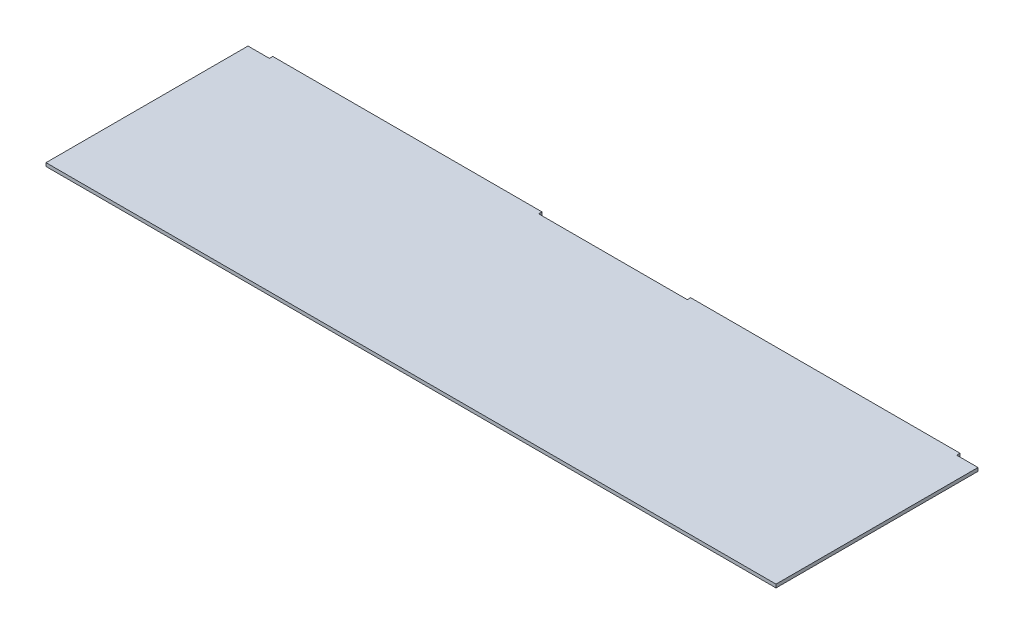
ISO-10303-21;
HEADER;
FILE_DESCRIPTION(('STEP AP214'),'2;1');
FILE_NAME('part.step','',(''),(''),'','','');
FILE_SCHEMA(('AUTOMOTIVE_DESIGN { 1 0 10303 214 1 1 1 1 }'));
ENDSEC;
DATA;
#1=APPLICATION_CONTEXT('core data for automotive mechanical design processes');
#2=APPLICATION_PROTOCOL_DEFINITION('international standard','automotive_design',2000,#1);
#3=PRODUCT_CONTEXT('',#1,'mechanical');
#4=PRODUCT('Part','Part','',(#3));
#5=PRODUCT_RELATED_PRODUCT_CATEGORY('part','',(#4));
#6=PRODUCT_DEFINITION_FORMATION('','',#4);
#7=PRODUCT_DEFINITION_CONTEXT('part definition',#1,'design');
#8=PRODUCT_DEFINITION('design','',#6,#7);
#9=PRODUCT_DEFINITION_SHAPE('','',#8);
#10=(LENGTH_UNIT() NAMED_UNIT(*) SI_UNIT(.MILLI.,.METRE.));
#11=(NAMED_UNIT(*) PLANE_ANGLE_UNIT() SI_UNIT($,.RADIAN.));
#12=(NAMED_UNIT(*) SI_UNIT($,.STERADIAN.) SOLID_ANGLE_UNIT());
#13=UNCERTAINTY_MEASURE_WITH_UNIT(LENGTH_MEASURE(1.E-05),#10,'distance_accuracy_value','');
#14=(GEOMETRIC_REPRESENTATION_CONTEXT(3) GLOBAL_UNCERTAINTY_ASSIGNED_CONTEXT((#13)) GLOBAL_UNIT_ASSIGNED_CONTEXT((#10,
#11,#12)) REPRESENTATION_CONTEXT('',''));
#15=CARTESIAN_POINT('',(0.,0.,0.));
#16=DIRECTION('',(0.,0.,1.));
#17=DIRECTION('',(1.,0.,0.));
#18=AXIS2_PLACEMENT_3D('',#15,#16,#17);
#19=CARTESIAN_POINT('',(-344.2208,1.5875,-95.25));
#20=DIRECTION('',(0.,0.,1.));
#21=DIRECTION('',(1.,0.,0.));
#22=AXIS2_PLACEMENT_3D('',#19,#20,#21);
#23=PLANE('',#22);
#24=DIRECTION('',(0.,1.,0.));
#25=VECTOR('',#24,1.);
#26=CARTESIAN_POINT('',(-324.0659,-1.5875,-95.25));
#27=LINE('',#26,#25);
#28=CARTESIAN_POINT('',(-324.0659,-1.5875,-95.25));
#29=VERTEX_POINT('',#28);
#30=CARTESIAN_POINT('',(-324.0659,1.5875,-95.25));
#31=VERTEX_POINT('',#30);
#32=EDGE_CURVE('E231',#29,#31,#27,.T.);
#33=ORIENTED_EDGE('',*,*,#32,.F.);
#34=DIRECTION('',(-1.,0.,0.));
#35=VECTOR('',#34,1.);
#36=CARTESIAN_POINT('',(-344.2208,-1.5875,-95.25));
#37=LINE('',#36,#35);
#38=CARTESIAN_POINT('',(-344.2208,-1.5875,-95.25));
#39=VERTEX_POINT('',#38);
#40=EDGE_CURVE('E146',#29,#39,#37,.T.);
#41=ORIENTED_EDGE('',*,*,#40,.T.);
#42=DIRECTION('',(0.,-1.,0.));
#43=VECTOR('',#42,1.);
#44=CARTESIAN_POINT('',(-344.2208,1.5875,-95.25));
#45=LINE('',#44,#43);
#46=CARTESIAN_POINT('',(-344.2208,1.5875,-95.25));
#47=VERTEX_POINT('',#46);
#48=EDGE_CURVE('E41',#47,#39,#45,.T.);
#49=ORIENTED_EDGE('',*,*,#48,.F.);
#50=DIRECTION('',(-1.,0.,0.));
#51=VECTOR('',#50,1.);
#52=CARTESIAN_POINT('',(-344.2208,1.5875,-95.25));
#53=LINE('',#52,#51);
#54=EDGE_CURVE('E48',#31,#47,#53,.T.);
#55=ORIENTED_EDGE('',*,*,#54,.F.);
#56=EDGE_LOOP('',(#33,#41,#49,#55));
#57=FACE_BOUND('',#56,.T.);
#58=ADVANCED_FACE('F33',(#57),#23,.F.);
#59=DIRECTION('',(0.,-1.,0.));
#60=VECTOR('',#59,1.);
#61=CARTESIAN_POINT('',(-70.0658999999999,-1.5875,-95.25));
#62=LINE('',#61,#60);
#63=CARTESIAN_POINT('',(-70.0658999999998,1.5875,-95.25));
#64=VERTEX_POINT('',#63);
#65=CARTESIAN_POINT('',(-70.0658999999998,-1.5875,-95.25));
#66=VERTEX_POINT('',#65);
#67=EDGE_CURVE('E56',#64,#66,#62,.T.);
#68=ORIENTED_EDGE('',*,*,#67,.F.);
#69=CARTESIAN_POINT('',(70.0658999999999,1.5875,-95.25));
#70=VERTEX_POINT('',#69);
#71=EDGE_CURVE('E188',#70,#64,#53,.T.);
#72=ORIENTED_EDGE('',*,*,#71,.F.);
#73=DIRECTION('',(0.,1.,0.));
#74=VECTOR('',#73,1.);
#75=CARTESIAN_POINT('',(70.0658999999999,-1.5875,-95.25));
#76=LINE('',#75,#74);
#77=CARTESIAN_POINT('',(70.0658999999998,-1.5875,-95.25));
#78=VERTEX_POINT('',#77);
#79=EDGE_CURVE('E150',#78,#70,#76,.T.);
#80=ORIENTED_EDGE('',*,*,#79,.F.);
#81=EDGE_CURVE('E198',#78,#66,#37,.T.);
#82=ORIENTED_EDGE('',*,*,#81,.T.);
#83=EDGE_LOOP('',(#68,#72,#80,#82));
#84=FACE_BOUND('',#83,.T.);
#85=ADVANCED_FACE('F235',(#84),#23,.F.);
#86=DIRECTION('',(0.,-1.,0.));
#87=VECTOR('',#86,1.);
#88=CARTESIAN_POINT('',(324.0659,-1.5875,-95.25));
#89=LINE('',#88,#87);
#90=CARTESIAN_POINT('',(324.0659,1.5875,-95.25));
#91=VERTEX_POINT('',#90);
#92=CARTESIAN_POINT('',(324.0659,-1.5875,-95.25));
#93=VERTEX_POINT('',#92);
#94=EDGE_CURVE('E147',#91,#93,#89,.T.);
#95=ORIENTED_EDGE('',*,*,#94,.F.);
#96=CARTESIAN_POINT('',(344.2208,1.5875,-95.25));
#97=VERTEX_POINT('',#96);
#98=EDGE_CURVE('E184',#97,#91,#53,.T.);
#99=ORIENTED_EDGE('',*,*,#98,.F.);
#100=DIRECTION('',(0.,-1.,0.));
#101=VECTOR('',#100,1.);
#102=CARTESIAN_POINT('',(344.2208,1.5875,-95.25));
#103=LINE('',#102,#101);
#104=CARTESIAN_POINT('',(344.2208,-1.5875,-95.25));
#105=VERTEX_POINT('',#104);
#106=EDGE_CURVE('E11',#97,#105,#103,.T.);
#107=ORIENTED_EDGE('',*,*,#106,.T.);
#108=EDGE_CURVE('E195',#105,#93,#37,.T.);
#109=ORIENTED_EDGE('',*,*,#108,.T.);
#110=EDGE_LOOP('',(#95,#99,#107,#109));
#111=FACE_BOUND('',#110,.T.);
#112=ADVANCED_FACE('F247',(#111),#23,.F.);
#113=CARTESIAN_POINT('',(344.2208,1.5875,-95.25));
#114=DIRECTION('',(-1.,0.,0.));
#115=DIRECTION('',(0.,0.,1.));
#116=AXIS2_PLACEMENT_3D('',#113,#114,#115);
#117=PLANE('',#116);
#118=DIRECTION('',(0.,0.,-1.));
#119=VECTOR('',#118,1.);
#120=CARTESIAN_POINT('',(344.2208,-1.5875,-95.25));
#121=LINE('',#120,#119);
#122=CARTESIAN_POINT('',(344.2208,-1.5875,95.25));
#123=VERTEX_POINT('',#122);
#124=EDGE_CURVE('E179',#123,#105,#121,.T.);
#125=ORIENTED_EDGE('',*,*,#124,.T.);
#126=ORIENTED_EDGE('',*,*,#106,.F.);
#127=DIRECTION('',(0.,0.,-1.));
#128=VECTOR('',#127,1.);
#129=CARTESIAN_POINT('',(344.2208,1.5875,-95.25));
#130=LINE('',#129,#128);
#131=CARTESIAN_POINT('',(344.2208,1.5875,95.25));
#132=VERTEX_POINT('',#131);
#133=EDGE_CURVE('E180',#132,#97,#130,.T.);
#134=ORIENTED_EDGE('',*,*,#133,.F.);
#135=DIRECTION('',(0.,-1.,0.));
#136=VECTOR('',#135,1.);
#137=CARTESIAN_POINT('',(344.2208,1.5875,95.25));
#138=LINE('',#137,#136);
#139=EDGE_CURVE('E192',#132,#123,#138,.T.);
#140=ORIENTED_EDGE('',*,*,#139,.T.);
#141=EDGE_LOOP('',(#125,#126,#134,#140));
#142=FACE_BOUND('',#141,.T.);
#143=ADVANCED_FACE('F35',(#142),#117,.F.);
#144=CARTESIAN_POINT('',(-344.2208,1.5875,-95.25));
#145=DIRECTION('',(1.,0.,0.));
#146=DIRECTION('',(0.,0.,-1.));
#147=AXIS2_PLACEMENT_3D('',#144,#145,#146);
#148=PLANE('',#147);
#149=DIRECTION('',(0.,0.,1.));
#150=VECTOR('',#149,1.);
#151=CARTESIAN_POINT('',(-344.2208,-1.5875,-95.25));
#152=LINE('',#151,#150);
#153=CARTESIAN_POINT('',(-344.2208,-1.5875,95.25));
#154=VERTEX_POINT('',#153);
#155=EDGE_CURVE('E197',#39,#154,#152,.T.);
#156=ORIENTED_EDGE('',*,*,#155,.T.);
#157=DIRECTION('',(0.,-1.,0.));
#158=VECTOR('',#157,1.);
#159=CARTESIAN_POINT('',(-344.2208,1.5875,95.25));
#160=LINE('',#159,#158);
#161=CARTESIAN_POINT('',(-344.2208,1.5875,95.25));
#162=VERTEX_POINT('',#161);
#163=EDGE_CURVE('E203',#162,#154,#160,.T.);
#164=ORIENTED_EDGE('',*,*,#163,.F.);
#165=DIRECTION('',(0.,0.,1.));
#166=VECTOR('',#165,1.);
#167=CARTESIAN_POINT('',(-344.2208,1.5875,-95.25));
#168=LINE('',#167,#166);
#169=EDGE_CURVE('E187',#47,#162,#168,.T.);
#170=ORIENTED_EDGE('',*,*,#169,.F.);
#171=ORIENTED_EDGE('',*,*,#48,.T.);
#172=EDGE_LOOP('',(#156,#164,#170,#171));
#173=FACE_BOUND('',#172,.T.);
#174=ADVANCED_FACE('F208',(#173),#148,.F.);
#175=CARTESIAN_POINT('',(-344.2208,1.5875,95.25));
#176=DIRECTION('',(0.,0.,-1.));
#177=DIRECTION('',(-1.,0.,0.));
#178=AXIS2_PLACEMENT_3D('',#175,#176,#177);
#179=PLANE('',#178);
#180=DIRECTION('',(1.,0.,0.));
#181=VECTOR('',#180,1.);
#182=CARTESIAN_POINT('',(-344.2208,-1.5875,95.25));
#183=LINE('',#182,#181);
#184=EDGE_CURVE('E183',#154,#123,#183,.T.);
#185=ORIENTED_EDGE('',*,*,#184,.T.);
#186=ORIENTED_EDGE('',*,*,#139,.F.);
#187=DIRECTION('',(1.,0.,0.));
#188=VECTOR('',#187,1.);
#189=CARTESIAN_POINT('',(-344.2208,1.5875,95.25));
#190=LINE('',#189,#188);
#191=EDGE_CURVE('E190',#162,#132,#190,.T.);
#192=ORIENTED_EDGE('',*,*,#191,.F.);
#193=ORIENTED_EDGE('',*,*,#163,.T.);
#194=EDGE_LOOP('',(#185,#186,#192,#193));
#195=FACE_BOUND('',#194,.T.);
#196=ADVANCED_FACE('F213',(#195),#179,.F.);
#197=CARTESIAN_POINT('',(0.,1.5875,0.));
#198=DIRECTION('',(0.,1.,0.));
#199=DIRECTION('',(0.,0.,1.));
#200=AXIS2_PLACEMENT_3D('',#197,#198,#199);
#201=PLANE('',#200);
#202=ORIENTED_EDGE('',*,*,#133,.T.);
#203=ORIENTED_EDGE('',*,*,#98,.T.);
#204=DIRECTION('',(0.,0.,1.));
#205=VECTOR('',#204,1.);
#206=CARTESIAN_POINT('',(324.0659,1.5875,-98.425));
#207=LINE('',#206,#205);
#208=CARTESIAN_POINT('',(324.0659,1.5875,-98.425));
#209=VERTEX_POINT('',#208);
#210=EDGE_CURVE('E164',#209,#91,#207,.T.);
#211=ORIENTED_EDGE('',*,*,#210,.F.);
#212=DIRECTION('',(1.,0.,0.));
#213=VECTOR('',#212,1.);
#214=CARTESIAN_POINT('',(324.0659,1.5875,-98.425));
#215=LINE('',#214,#213);
#216=CARTESIAN_POINT('',(70.0658999999999,1.5875,-98.425));
#217=VERTEX_POINT('',#216);
#218=EDGE_CURVE('E163',#217,#209,#215,.T.);
#219=ORIENTED_EDGE('',*,*,#218,.F.);
#220=DIRECTION('',(0.,0.,1.));
#221=VECTOR('',#220,1.);
#222=CARTESIAN_POINT('',(70.0658999999999,1.5875,-98.425));
#223=LINE('',#222,#221);
#224=EDGE_CURVE('E170',#217,#70,#223,.T.);
#225=ORIENTED_EDGE('',*,*,#224,.T.);
#226=ORIENTED_EDGE('',*,*,#71,.T.);
#227=DIRECTION('',(0.,0.,1.));
#228=VECTOR('',#227,1.);
#229=CARTESIAN_POINT('',(-70.0658999999999,1.5875,-98.425));
#230=LINE('',#229,#228);
#231=CARTESIAN_POINT('',(-70.0658999999999,1.5875,-98.425));
#232=VERTEX_POINT('',#231);
#233=EDGE_CURVE('E152',#232,#64,#230,.T.);
#234=ORIENTED_EDGE('',*,*,#233,.F.);
#235=DIRECTION('',(1.,0.,0.));
#236=VECTOR('',#235,1.);
#237=CARTESIAN_POINT('',(-324.0659,1.5875,-98.425));
#238=LINE('',#237,#236);
#239=CARTESIAN_POINT('',(-324.0659,1.5875,-98.425));
#240=VERTEX_POINT('',#239);
#241=EDGE_CURVE('E132',#240,#232,#238,.T.);
#242=ORIENTED_EDGE('',*,*,#241,.F.);
#243=DIRECTION('',(0.,0.,1.));
#244=VECTOR('',#243,1.);
#245=CARTESIAN_POINT('',(-324.0659,1.5875,-98.425));
#246=LINE('',#245,#244);
#247=EDGE_CURVE('E129',#240,#31,#246,.T.);
#248=ORIENTED_EDGE('',*,*,#247,.T.);
#249=ORIENTED_EDGE('',*,*,#54,.T.);
#250=ORIENTED_EDGE('',*,*,#169,.T.);
#251=ORIENTED_EDGE('',*,*,#191,.T.);
#252=EDGE_LOOP('',(#202,#203,#211,#219,#225,#226,#234,#242,#248,#249,#250,#251));
#253=FACE_BOUND('',#252,.T.);
#254=ADVANCED_FACE('F219',(#253),#201,.T.);
#255=CARTESIAN_POINT('',(0.,-1.5875,0.));
#256=DIRECTION('',(0.,1.,0.));
#257=DIRECTION('',(0.,0.,1.));
#258=AXIS2_PLACEMENT_3D('',#255,#256,#257);
#259=PLANE('',#258);
#260=ORIENTED_EDGE('',*,*,#124,.F.);
#261=ORIENTED_EDGE('',*,*,#184,.F.);
#262=ORIENTED_EDGE('',*,*,#155,.F.);
#263=ORIENTED_EDGE('',*,*,#40,.F.);
#264=DIRECTION('',(0.,0.,1.));
#265=VECTOR('',#264,1.);
#266=CARTESIAN_POINT('',(-324.0659,-1.5875,-98.425));
#267=LINE('',#266,#265);
#268=CARTESIAN_POINT('',(-324.0659,-1.5875,-98.425));
#269=VERTEX_POINT('',#268);
#270=EDGE_CURVE('E127',#269,#29,#267,.T.);
#271=ORIENTED_EDGE('',*,*,#270,.F.);
#272=DIRECTION('',(-1.,0.,0.));
#273=VECTOR('',#272,1.);
#274=CARTESIAN_POINT('',(-324.0659,-1.5875,-98.425));
#275=LINE('',#274,#273);
#276=CARTESIAN_POINT('',(-70.0658999999999,-1.5875,-98.425));
#277=VERTEX_POINT('',#276);
#278=EDGE_CURVE('E133',#277,#269,#275,.T.);
#279=ORIENTED_EDGE('',*,*,#278,.F.);
#280=DIRECTION('',(0.,0.,1.));
#281=VECTOR('',#280,1.);
#282=CARTESIAN_POINT('',(-70.0658999999999,-1.5875,-98.425));
#283=LINE('',#282,#281);
#284=EDGE_CURVE('E227',#277,#66,#283,.T.);
#285=ORIENTED_EDGE('',*,*,#284,.T.);
#286=ORIENTED_EDGE('',*,*,#81,.F.);
#287=DIRECTION('',(0.,0.,1.));
#288=VECTOR('',#287,1.);
#289=CARTESIAN_POINT('',(70.0658999999999,-1.5875,-98.425));
#290=LINE('',#289,#288);
#291=CARTESIAN_POINT('',(70.0658999999999,-1.5875,-98.425));
#292=VERTEX_POINT('',#291);
#293=EDGE_CURVE('E173',#292,#78,#290,.T.);
#294=ORIENTED_EDGE('',*,*,#293,.F.);
#295=DIRECTION('',(-1.,0.,0.));
#296=VECTOR('',#295,1.);
#297=CARTESIAN_POINT('',(324.0659,-1.5875,-98.425));
#298=LINE('',#297,#296);
#299=CARTESIAN_POINT('',(324.0659,-1.5875,-98.425));
#300=VERTEX_POINT('',#299);
#301=EDGE_CURVE('E159',#300,#292,#298,.T.);
#302=ORIENTED_EDGE('',*,*,#301,.F.);
#303=DIRECTION('',(0.,0.,1.));
#304=VECTOR('',#303,1.);
#305=CARTESIAN_POINT('',(324.0659,-1.5875,-98.425));
#306=LINE('',#305,#304);
#307=EDGE_CURVE('E176',#300,#93,#306,.T.);
#308=ORIENTED_EDGE('',*,*,#307,.T.);
#309=ORIENTED_EDGE('',*,*,#108,.F.);
#310=EDGE_LOOP('',(#260,#261,#262,#263,#271,#279,#285,#286,#294,#302,#308,#309));
#311=FACE_BOUND('',#310,.T.);
#312=ADVANCED_FACE('F144',(#311),#259,.F.);
#313=CARTESIAN_POINT('',(324.0659,-1.5875,-98.425));
#314=DIRECTION('',(-1.,0.,0.));
#315=DIRECTION('',(0.,0.,1.));
#316=AXIS2_PLACEMENT_3D('',#313,#314,#315);
#317=PLANE('',#316);
#318=ORIENTED_EDGE('',*,*,#94,.T.);
#319=ORIENTED_EDGE('',*,*,#307,.F.);
#320=DIRECTION('',(0.,-1.,0.));
#321=VECTOR('',#320,1.);
#322=CARTESIAN_POINT('',(324.0659,-1.5875,-98.425));
#323=LINE('',#322,#321);
#324=EDGE_CURVE('E156',#209,#300,#323,.T.);
#325=ORIENTED_EDGE('',*,*,#324,.F.);
#326=ORIENTED_EDGE('',*,*,#210,.T.);
#327=EDGE_LOOP('',(#318,#319,#325,#326));
#328=FACE_BOUND('',#327,.T.);
#329=ADVANCED_FACE('F245',(#328),#317,.F.);
#330=CARTESIAN_POINT('',(70.0658999999999,-1.5875,-98.425));
#331=DIRECTION('',(1.,0.,0.));
#332=DIRECTION('',(0.,0.,-1.));
#333=AXIS2_PLACEMENT_3D('',#330,#331,#332);
#334=PLANE('',#333);
#335=ORIENTED_EDGE('',*,*,#79,.T.);
#336=ORIENTED_EDGE('',*,*,#224,.F.);
#337=DIRECTION('',(0.,1.,0.));
#338=VECTOR('',#337,1.);
#339=CARTESIAN_POINT('',(70.0658999999999,-1.5875,-98.425));
#340=LINE('',#339,#338);
#341=EDGE_CURVE('E161',#292,#217,#340,.T.);
#342=ORIENTED_EDGE('',*,*,#341,.F.);
#343=ORIENTED_EDGE('',*,*,#293,.T.);
#344=EDGE_LOOP('',(#335,#336,#342,#343));
#345=FACE_BOUND('',#344,.T.);
#346=ADVANCED_FACE('F239',(#345),#334,.F.);
#347=CARTESIAN_POINT('',(0.,0.,-98.425));
#348=DIRECTION('',(0.,0.,1.));
#349=DIRECTION('',(1.,0.,0.));
#350=AXIS2_PLACEMENT_3D('',#347,#348,#349);
#351=PLANE('',#350);
#352=ORIENTED_EDGE('',*,*,#324,.T.);
#353=ORIENTED_EDGE('',*,*,#301,.T.);
#354=ORIENTED_EDGE('',*,*,#341,.T.);
#355=ORIENTED_EDGE('',*,*,#218,.T.);
#356=EDGE_LOOP('',(#352,#353,#354,#355));
#357=FACE_BOUND('',#356,.T.);
#358=ADVANCED_FACE('F241',(#357),#351,.F.);
#359=CARTESIAN_POINT('',(-324.0659,-1.5875,-98.425));
#360=DIRECTION('',(1.,0.,0.));
#361=DIRECTION('',(0.,0.,-1.));
#362=AXIS2_PLACEMENT_3D('',#359,#360,#361);
#363=PLANE('',#362);
#364=ORIENTED_EDGE('',*,*,#32,.T.);
#365=ORIENTED_EDGE('',*,*,#247,.F.);
#366=DIRECTION('',(0.,1.,0.));
#367=VECTOR('',#366,1.);
#368=CARTESIAN_POINT('',(-324.0659,-1.5875,-98.425));
#369=LINE('',#368,#367);
#370=EDGE_CURVE('E123',#269,#240,#369,.T.);
#371=ORIENTED_EDGE('',*,*,#370,.F.);
#372=ORIENTED_EDGE('',*,*,#270,.T.);
#373=EDGE_LOOP('',(#364,#365,#371,#372));
#374=FACE_BOUND('',#373,.T.);
#375=ADVANCED_FACE('F125',(#374),#363,.F.);
#376=CARTESIAN_POINT('',(-70.0658999999999,-1.5875,-98.425));
#377=DIRECTION('',(-1.,0.,0.));
#378=DIRECTION('',(0.,0.,1.));
#379=AXIS2_PLACEMENT_3D('',#376,#377,#378);
#380=PLANE('',#379);
#381=ORIENTED_EDGE('',*,*,#67,.T.);
#382=ORIENTED_EDGE('',*,*,#284,.F.);
#383=DIRECTION('',(0.,-1.,0.));
#384=VECTOR('',#383,1.);
#385=CARTESIAN_POINT('',(-70.0658999999999,-1.5875,-98.425));
#386=LINE('',#385,#384);
#387=EDGE_CURVE('E138',#232,#277,#386,.T.);
#388=ORIENTED_EDGE('',*,*,#387,.F.);
#389=ORIENTED_EDGE('',*,*,#233,.T.);
#390=EDGE_LOOP('',(#381,#382,#388,#389));
#391=FACE_BOUND('',#390,.T.);
#392=ADVANCED_FACE('F226',(#391),#380,.F.);
#393=CARTESIAN_POINT('',(0.,0.,-98.425));
#394=DIRECTION('',(0.,0.,1.));
#395=DIRECTION('',(1.,0.,0.));
#396=AXIS2_PLACEMENT_3D('',#393,#394,#395);
#397=PLANE('',#396);
#398=ORIENTED_EDGE('',*,*,#278,.T.);
#399=ORIENTED_EDGE('',*,*,#370,.T.);
#400=ORIENTED_EDGE('',*,*,#241,.T.);
#401=ORIENTED_EDGE('',*,*,#387,.T.);
#402=EDGE_LOOP('',(#398,#399,#400,#401));
#403=FACE_BOUND('',#402,.T.);
#404=ADVANCED_FACE('F136',(#403),#397,.F.);
#405=CLOSED_SHELL('',(#58,#85,#112,#143,#174,#196,#254,#312,#329,#346,#358,#375,#392,#404));
#406=MANIFOLD_SOLID_BREP('B2',#405);
#407=ADVANCED_BREP_SHAPE_REPRESENTATION('',(#18,#406),#14);
#408=SHAPE_DEFINITION_REPRESENTATION(#9,#407);
ENDSEC;
END-ISO-10303-21;
